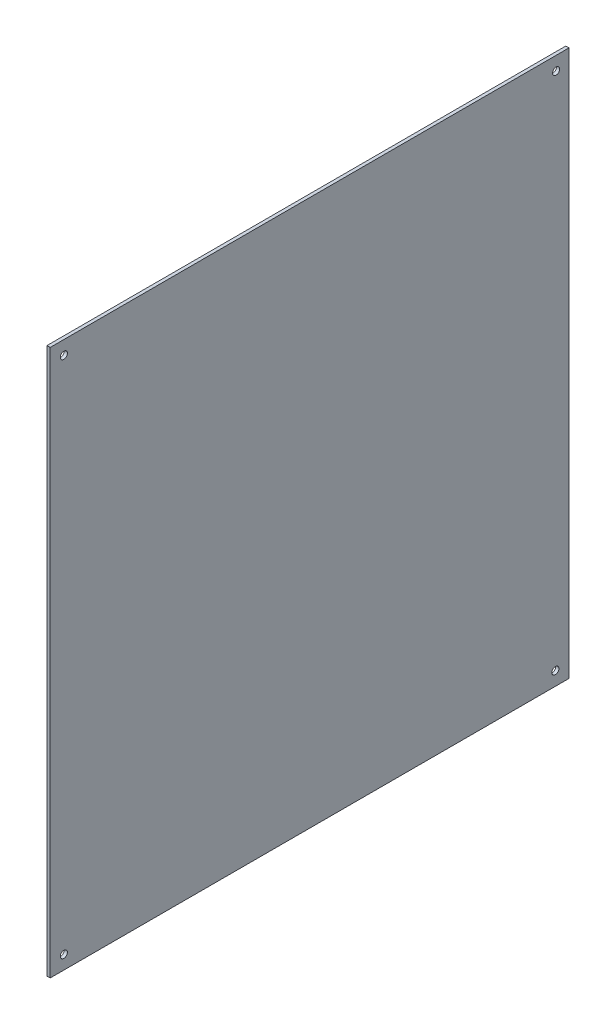
ISO-10303-21;
HEADER;
FILE_DESCRIPTION(('STEP AP214'),'2;1');
FILE_NAME('part.step','',(''),(''),'','','');
FILE_SCHEMA(('AUTOMOTIVE_DESIGN { 1 0 10303 214 1 1 1 1 }'));
ENDSEC;
DATA;
#1=APPLICATION_CONTEXT('core data for automotive mechanical design processes');
#2=APPLICATION_PROTOCOL_DEFINITION('international standard','automotive_design',2000,#1);
#3=PRODUCT_CONTEXT('',#1,'mechanical');
#4=PRODUCT('Part','Part','',(#3));
#5=PRODUCT_RELATED_PRODUCT_CATEGORY('part','',(#4));
#6=PRODUCT_DEFINITION_FORMATION('','',#4);
#7=PRODUCT_DEFINITION_CONTEXT('part definition',#1,'design');
#8=PRODUCT_DEFINITION('design','',#6,#7);
#9=PRODUCT_DEFINITION_SHAPE('','',#8);
#10=(LENGTH_UNIT() NAMED_UNIT(*) SI_UNIT(.MILLI.,.METRE.));
#11=(NAMED_UNIT(*) PLANE_ANGLE_UNIT() SI_UNIT($,.RADIAN.));
#12=(NAMED_UNIT(*) SI_UNIT($,.STERADIAN.) SOLID_ANGLE_UNIT());
#13=UNCERTAINTY_MEASURE_WITH_UNIT(LENGTH_MEASURE(1.E-05),#10,'distance_accuracy_value','');
#14=(GEOMETRIC_REPRESENTATION_CONTEXT(3) GLOBAL_UNCERTAINTY_ASSIGNED_CONTEXT((#13)) GLOBAL_UNIT_ASSIGNED_CONTEXT((#10,
#11,#12)) REPRESENTATION_CONTEXT('',''));
#15=CARTESIAN_POINT('',(0.,0.,0.));
#16=DIRECTION('',(0.,0.,1.));
#17=DIRECTION('',(1.,0.,0.));
#18=AXIS2_PLACEMENT_3D('',#15,#16,#17);
#19=CARTESIAN_POINT('',(3.,0.,-521.524184205278));
#20=DIRECTION('',(0.,0.,-1.));
#21=DIRECTION('',(0.,1.,0.));
#22=AXIS2_PLACEMENT_3D('',#19,#20,#21);
#23=PLANE('',#22);
#24=DIRECTION('',(0.,-1.,0.));
#25=VECTOR('',#24,1.);
#26=CARTESIAN_POINT('',(0.,0.,-521.524184205278));
#27=LINE('',#26,#25);
#28=CARTESIAN_POINT('',(0.,0.,-521.524184205278));
#29=VERTEX_POINT('',#28);
#30=CARTESIAN_POINT('',(0.,-508.,-521.524184205278));
#31=VERTEX_POINT('',#30);
#32=EDGE_CURVE('E98',#29,#31,#27,.T.);
#33=ORIENTED_EDGE('',*,*,#32,.T.);
#34=DIRECTION('',(-1.,0.,0.));
#35=VECTOR('',#34,1.);
#36=CARTESIAN_POINT('',(3.,-508.,-521.524184205278));
#37=LINE('',#36,#35);
#38=CARTESIAN_POINT('',(3.,-508.,-521.524184205278));
#39=VERTEX_POINT('',#38);
#40=EDGE_CURVE('E11',#39,#31,#37,.T.);
#41=ORIENTED_EDGE('',*,*,#40,.F.);
#42=DIRECTION('',(0.,-1.,0.));
#43=VECTOR('',#42,1.);
#44=CARTESIAN_POINT('',(3.,0.,-521.524184205278));
#45=LINE('',#44,#43);
#46=CARTESIAN_POINT('',(3.,0.,-521.524184205278));
#47=VERTEX_POINT('',#46);
#48=EDGE_CURVE('E86',#47,#39,#45,.T.);
#49=ORIENTED_EDGE('',*,*,#48,.F.);
#50=DIRECTION('',(-1.,0.,0.));
#51=VECTOR('',#50,1.);
#52=CARTESIAN_POINT('',(3.,0.,-521.524184205278));
#53=LINE('',#52,#51);
#54=EDGE_CURVE('E94',#47,#29,#53,.T.);
#55=ORIENTED_EDGE('',*,*,#54,.T.);
#56=EDGE_LOOP('',(#33,#41,#49,#55));
#57=FACE_BOUND('',#56,.T.);
#58=ADVANCED_FACE('F35',(#57),#23,.F.);
#59=CARTESIAN_POINT('',(3.,-508.,-521.524184205278));
#60=DIRECTION('',(0.,1.,0.));
#61=DIRECTION('',(0.,0.,1.));
#62=AXIS2_PLACEMENT_3D('',#59,#60,#61);
#63=PLANE('',#62);
#64=DIRECTION('',(0.,0.,-1.));
#65=VECTOR('',#64,1.);
#66=CARTESIAN_POINT('',(0.,-508.,-521.524184205278));
#67=LINE('',#66,#65);
#68=CARTESIAN_POINT('',(0.,-508.,-1004.12418420528));
#69=VERTEX_POINT('',#68);
#70=EDGE_CURVE('E90',#31,#69,#67,.T.);
#71=ORIENTED_EDGE('',*,*,#70,.T.);
#72=DIRECTION('',(-1.,0.,0.));
#73=VECTOR('',#72,1.);
#74=CARTESIAN_POINT('',(3.,-508.,-1004.12418420528));
#75=LINE('',#74,#73);
#76=CARTESIAN_POINT('',(3.,-508.,-1004.12418420528));
#77=VERTEX_POINT('',#76);
#78=EDGE_CURVE('E43',#77,#69,#75,.T.);
#79=ORIENTED_EDGE('',*,*,#78,.F.);
#80=DIRECTION('',(0.,0.,-1.));
#81=VECTOR('',#80,1.);
#82=CARTESIAN_POINT('',(3.,-508.,-521.524184205278));
#83=LINE('',#82,#81);
#84=EDGE_CURVE('E81',#39,#77,#83,.T.);
#85=ORIENTED_EDGE('',*,*,#84,.F.);
#86=ORIENTED_EDGE('',*,*,#40,.T.);
#87=EDGE_LOOP('',(#71,#79,#85,#86));
#88=FACE_BOUND('',#87,.T.);
#89=ADVANCED_FACE('F89',(#88),#63,.F.);
#90=CARTESIAN_POINT('',(3.,0.,-1004.12418420528));
#91=DIRECTION('',(0.,0.,1.));
#92=DIRECTION('',(1.,0.,0.));
#93=AXIS2_PLACEMENT_3D('',#90,#91,#92);
#94=PLANE('',#93);
#95=DIRECTION('',(0.,1.,0.));
#96=VECTOR('',#95,1.);
#97=CARTESIAN_POINT('',(0.,0.,-1004.12418420528));
#98=LINE('',#97,#96);
#99=CARTESIAN_POINT('',(0.,0.,-1004.12418420528));
#100=VERTEX_POINT('',#99);
#101=EDGE_CURVE('E68',#69,#100,#98,.T.);
#102=ORIENTED_EDGE('',*,*,#101,.T.);
#103=DIRECTION('',(-1.,0.,0.));
#104=VECTOR('',#103,1.);
#105=CARTESIAN_POINT('',(3.,0.,-1004.12418420528));
#106=LINE('',#105,#104);
#107=CARTESIAN_POINT('',(3.,0.,-1004.12418420528));
#108=VERTEX_POINT('',#107);
#109=EDGE_CURVE('E91',#108,#100,#106,.T.);
#110=ORIENTED_EDGE('',*,*,#109,.F.);
#111=DIRECTION('',(0.,1.,0.));
#112=VECTOR('',#111,1.);
#113=CARTESIAN_POINT('',(3.,0.,-1004.12418420528));
#114=LINE('',#113,#112);
#115=EDGE_CURVE('E84',#77,#108,#114,.T.);
#116=ORIENTED_EDGE('',*,*,#115,.F.);
#117=ORIENTED_EDGE('',*,*,#78,.T.);
#118=EDGE_LOOP('',(#102,#110,#116,#117));
#119=FACE_BOUND('',#118,.T.);
#120=ADVANCED_FACE('F92',(#119),#94,.F.);
#121=CARTESIAN_POINT('',(3.,0.,-521.524184205278));
#122=DIRECTION('',(0.,-1.,0.));
#123=DIRECTION('',(0.,0.,-1.));
#124=AXIS2_PLACEMENT_3D('',#121,#122,#123);
#125=PLANE('',#124);
#126=DIRECTION('',(0.,0.,1.));
#127=VECTOR('',#126,1.);
#128=CARTESIAN_POINT('',(0.,0.,-521.524184205278));
#129=LINE('',#128,#127);
#130=EDGE_CURVE('E74',#100,#29,#129,.T.);
#131=ORIENTED_EDGE('',*,*,#130,.T.);
#132=ORIENTED_EDGE('',*,*,#54,.F.);
#133=DIRECTION('',(0.,0.,1.));
#134=VECTOR('',#133,1.);
#135=CARTESIAN_POINT('',(3.,0.,-521.524184205278));
#136=LINE('',#135,#134);
#137=EDGE_CURVE('E51',#108,#47,#136,.T.);
#138=ORIENTED_EDGE('',*,*,#137,.F.);
#139=ORIENTED_EDGE('',*,*,#109,.T.);
#140=EDGE_LOOP('',(#131,#132,#138,#139));
#141=FACE_BOUND('',#140,.T.);
#142=ADVANCED_FACE('F106',(#141),#125,.F.);
#143=CARTESIAN_POINT('',(3.,0.,0.));
#144=DIRECTION('',(1.,0.,0.));
#145=DIRECTION('',(0.,0.,-1.));
#146=AXIS2_PLACEMENT_3D('',#143,#144,#145);
#147=PLANE('',#146);
#148=CARTESIAN_POINT('',(3.,-495.3,-991.424184205278));
#149=DIRECTION('',(1.,0.,0.));
#150=DIRECTION('',(0.,0.,-1.));
#151=AXIS2_PLACEMENT_3D('',#148,#149,#150);
#152=CIRCLE('',#151,3.2950000000001);
#153=CARTESIAN_POINT('',(3.,-495.3,-994.719184205278));
#154=VERTEX_POINT('',#153);
#155=EDGE_CURVE('E118',#154,#154,#152,.T.);
#156=ORIENTED_EDGE('',*,*,#155,.F.);
#157=EDGE_LOOP('',(#156));
#158=FACE_BOUND('',#157,.T.);
#159=CARTESIAN_POINT('',(3.,-495.3,-534.224184205278));
#160=DIRECTION('',(1.,0.,0.));
#161=DIRECTION('',(0.,0.,-1.));
#162=AXIS2_PLACEMENT_3D('',#159,#160,#161);
#163=CIRCLE('',#162,3.2950000000001);
#164=CARTESIAN_POINT('',(3.,-495.3,-537.519184205278));
#165=VERTEX_POINT('',#164);
#166=EDGE_CURVE('E124',#165,#165,#163,.T.);
#167=ORIENTED_EDGE('',*,*,#166,.F.);
#168=EDGE_LOOP('',(#167));
#169=FACE_BOUND('',#168,.T.);
#170=CARTESIAN_POINT('',(3.,-12.7,-534.224184205278));
#171=DIRECTION('',(1.,0.,0.));
#172=DIRECTION('',(0.,0.,-1.));
#173=AXIS2_PLACEMENT_3D('',#170,#171,#172);
#174=CIRCLE('',#173,3.29500000000021);
#175=CARTESIAN_POINT('',(3.,-12.7,-537.519184205278));
#176=VERTEX_POINT('',#175);
#177=EDGE_CURVE('E130',#176,#176,#174,.T.);
#178=ORIENTED_EDGE('',*,*,#177,.F.);
#179=EDGE_LOOP('',(#178));
#180=FACE_BOUND('',#179,.T.);
#181=CARTESIAN_POINT('',(3.,-12.7,-992.124184205278));
#182=DIRECTION('',(1.,0.,0.));
#183=DIRECTION('',(0.,0.,-1.));
#184=AXIS2_PLACEMENT_3D('',#181,#182,#183);
#185=CIRCLE('',#184,3.2950000000001);
#186=CARTESIAN_POINT('',(3.,-12.7,-995.419184205278));
#187=VERTEX_POINT('',#186);
#188=EDGE_CURVE('E112',#187,#187,#185,.T.);
#189=ORIENTED_EDGE('',*,*,#188,.F.);
#190=EDGE_LOOP('',(#189));
#191=FACE_BOUND('',#190,.T.);
#192=ORIENTED_EDGE('',*,*,#48,.T.);
#193=ORIENTED_EDGE('',*,*,#84,.T.);
#194=ORIENTED_EDGE('',*,*,#115,.T.);
#195=ORIENTED_EDGE('',*,*,#137,.T.);
#196=EDGE_LOOP('',(#192,#193,#194,#195));
#197=FACE_BOUND('',#196,.T.);
#198=ADVANCED_FACE('F82',(#158,#169,#180,#191,#197),#147,.T.);
#199=CARTESIAN_POINT('',(0.,0.,0.));
#200=DIRECTION('',(1.,0.,0.));
#201=DIRECTION('',(0.,0.,-1.));
#202=AXIS2_PLACEMENT_3D('',#199,#200,#201);
#203=PLANE('',#202);
#204=CARTESIAN_POINT('',(0.,-495.3,-991.424184205278));
#205=DIRECTION('',(1.,0.,0.));
#206=DIRECTION('',(0.,0.,-1.));
#207=AXIS2_PLACEMENT_3D('',#204,#205,#206);
#208=CIRCLE('',#207,3.2950000000001);
#209=CARTESIAN_POINT('',(0.,-495.3,-994.719184205278));
#210=VERTEX_POINT('',#209);
#211=EDGE_CURVE('E121',#210,#210,#208,.T.);
#212=ORIENTED_EDGE('',*,*,#211,.T.);
#213=EDGE_LOOP('',(#212));
#214=FACE_BOUND('',#213,.T.);
#215=CARTESIAN_POINT('',(0.,-495.3,-534.224184205278));
#216=DIRECTION('',(1.,0.,0.));
#217=DIRECTION('',(0.,0.,-1.));
#218=AXIS2_PLACEMENT_3D('',#215,#216,#217);
#219=CIRCLE('',#218,3.2950000000001);
#220=CARTESIAN_POINT('',(0.,-495.3,-537.519184205278));
#221=VERTEX_POINT('',#220);
#222=EDGE_CURVE('E127',#221,#221,#219,.T.);
#223=ORIENTED_EDGE('',*,*,#222,.T.);
#224=EDGE_LOOP('',(#223));
#225=FACE_BOUND('',#224,.T.);
#226=CARTESIAN_POINT('',(0.,-12.7,-534.224184205278));
#227=DIRECTION('',(1.,0.,0.));
#228=DIRECTION('',(0.,0.,-1.));
#229=AXIS2_PLACEMENT_3D('',#226,#227,#228);
#230=CIRCLE('',#229,3.29500000000021);
#231=CARTESIAN_POINT('',(0.,-12.7,-537.519184205278));
#232=VERTEX_POINT('',#231);
#233=EDGE_CURVE('E115',#232,#232,#230,.T.);
#234=ORIENTED_EDGE('',*,*,#233,.T.);
#235=EDGE_LOOP('',(#234));
#236=FACE_BOUND('',#235,.T.);
#237=CARTESIAN_POINT('',(0.,-12.7,-992.124184205278));
#238=DIRECTION('',(1.,0.,0.));
#239=DIRECTION('',(0.,0.,-1.));
#240=AXIS2_PLACEMENT_3D('',#237,#238,#239);
#241=CIRCLE('',#240,3.2950000000001);
#242=CARTESIAN_POINT('',(0.,-12.7,-995.419184205278));
#243=VERTEX_POINT('',#242);
#244=EDGE_CURVE('E101',#243,#243,#241,.T.);
#245=ORIENTED_EDGE('',*,*,#244,.T.);
#246=EDGE_LOOP('',(#245));
#247=FACE_BOUND('',#246,.T.);
#248=ORIENTED_EDGE('',*,*,#32,.F.);
#249=ORIENTED_EDGE('',*,*,#130,.F.);
#250=ORIENTED_EDGE('',*,*,#101,.F.);
#251=ORIENTED_EDGE('',*,*,#70,.F.);
#252=EDGE_LOOP('',(#248,#249,#250,#251));
#253=FACE_BOUND('',#252,.T.);
#254=ADVANCED_FACE('F109',(#214,#225,#236,#247,#253),#203,.F.);
#255=CARTESIAN_POINT('',(0.,-12.7,-992.124184205278));
#256=DIRECTION('',(1.,0.,0.));
#257=DIRECTION('',(0.,0.,-1.));
#258=AXIS2_PLACEMENT_3D('',#255,#256,#257);
#259=CYLINDRICAL_SURFACE('',#258,3.2950000000001);
#260=ORIENTED_EDGE('',*,*,#244,.F.);
#261=EDGE_LOOP('',(#260));
#262=FACE_BOUND('',#261,.T.);
#263=ORIENTED_EDGE('',*,*,#188,.T.);
#264=EDGE_LOOP('',(#263));
#265=FACE_BOUND('',#264,.T.);
#266=ADVANCED_FACE('F142',(#262,#265),#259,.F.);
#267=CARTESIAN_POINT('',(0.,-12.7,-534.224184205278));
#268=DIRECTION('',(1.,0.,0.));
#269=DIRECTION('',(0.,0.,-1.));
#270=AXIS2_PLACEMENT_3D('',#267,#268,#269);
#271=CYLINDRICAL_SURFACE('',#270,3.29500000000021);
#272=ORIENTED_EDGE('',*,*,#233,.F.);
#273=EDGE_LOOP('',(#272));
#274=FACE_BOUND('',#273,.T.);
#275=ORIENTED_EDGE('',*,*,#177,.T.);
#276=EDGE_LOOP('',(#275));
#277=FACE_BOUND('',#276,.T.);
#278=ADVANCED_FACE('F138',(#274,#277),#271,.F.);
#279=CARTESIAN_POINT('',(0.,-495.3,-534.224184205278));
#280=DIRECTION('',(1.,0.,0.));
#281=DIRECTION('',(0.,0.,-1.));
#282=AXIS2_PLACEMENT_3D('',#279,#280,#281);
#283=CYLINDRICAL_SURFACE('',#282,3.2950000000001);
#284=ORIENTED_EDGE('',*,*,#222,.F.);
#285=EDGE_LOOP('',(#284));
#286=FACE_BOUND('',#285,.T.);
#287=ORIENTED_EDGE('',*,*,#166,.T.);
#288=EDGE_LOOP('',(#287));
#289=FACE_BOUND('',#288,.T.);
#290=ADVANCED_FACE('F141',(#286,#289),#283,.F.);
#291=CARTESIAN_POINT('',(0.,-495.3,-991.424184205278));
#292=DIRECTION('',(1.,0.,0.));
#293=DIRECTION('',(0.,0.,-1.));
#294=AXIS2_PLACEMENT_3D('',#291,#292,#293);
#295=CYLINDRICAL_SURFACE('',#294,3.2950000000001);
#296=ORIENTED_EDGE('',*,*,#211,.F.);
#297=EDGE_LOOP('',(#296));
#298=FACE_BOUND('',#297,.T.);
#299=ORIENTED_EDGE('',*,*,#155,.T.);
#300=EDGE_LOOP('',(#299));
#301=FACE_BOUND('',#300,.T.);
#302=ADVANCED_FACE('F203',(#298,#301),#295,.F.);
#303=CLOSED_SHELL('',(#58,#89,#120,#142,#198,#254,#266,#278,#290,#302));
#304=MANIFOLD_SOLID_BREP('B2',#303);
#305=ADVANCED_BREP_SHAPE_REPRESENTATION('',(#18,#304),#14);
#306=SHAPE_DEFINITION_REPRESENTATION(#9,#305);
ENDSEC;
END-ISO-10303-21;
